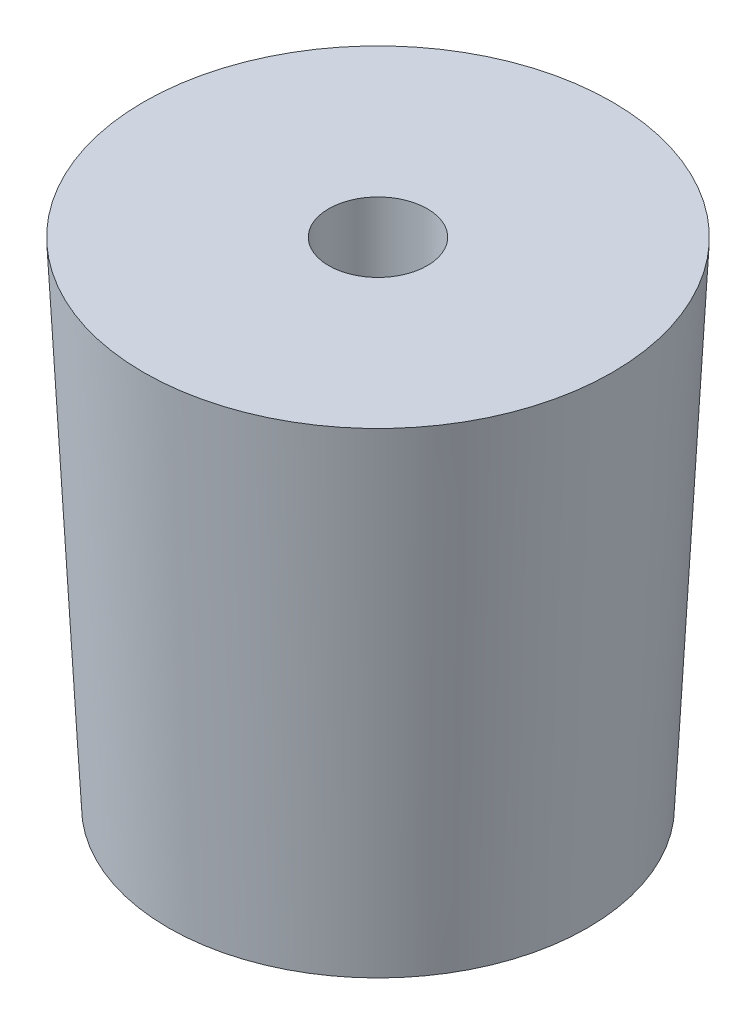
ISO-10303-21;
HEADER;
FILE_DESCRIPTION(('STEP AP214'),'2;1');
FILE_NAME('part.step','',(''),(''),'','','');
FILE_SCHEMA(('AUTOMOTIVE_DESIGN { 1 0 10303 214 1 1 1 1 }'));
ENDSEC;
DATA;
#1=APPLICATION_CONTEXT('core data for automotive mechanical design processes');
#2=APPLICATION_PROTOCOL_DEFINITION('international standard','automotive_design',2000,#1);
#3=PRODUCT_CONTEXT('',#1,'mechanical');
#4=PRODUCT('Part','Part','',(#3));
#5=PRODUCT_RELATED_PRODUCT_CATEGORY('part','',(#4));
#6=PRODUCT_DEFINITION_FORMATION('','',#4);
#7=PRODUCT_DEFINITION_CONTEXT('part definition',#1,'design');
#8=PRODUCT_DEFINITION('design','',#6,#7);
#9=PRODUCT_DEFINITION_SHAPE('','',#8);
#10=(LENGTH_UNIT() NAMED_UNIT(*) SI_UNIT(.MILLI.,.METRE.));
#11=(NAMED_UNIT(*) PLANE_ANGLE_UNIT() SI_UNIT($,.RADIAN.));
#12=(NAMED_UNIT(*) SI_UNIT($,.STERADIAN.) SOLID_ANGLE_UNIT());
#13=UNCERTAINTY_MEASURE_WITH_UNIT(LENGTH_MEASURE(1.E-05),#10,'distance_accuracy_value','');
#14=(GEOMETRIC_REPRESENTATION_CONTEXT(3) GLOBAL_UNCERTAINTY_ASSIGNED_CONTEXT((#13)) GLOBAL_UNIT_ASSIGNED_CONTEXT((#10,
#11,#12)) REPRESENTATION_CONTEXT('',''));
#15=CARTESIAN_POINT('',(0.,0.,0.));
#16=DIRECTION('',(0.,0.,1.));
#17=DIRECTION('',(1.,0.,0.));
#18=AXIS2_PLACEMENT_3D('',#15,#16,#17);
#19=CARTESIAN_POINT('',(0.,20.,0.));
#20=DIRECTION('',(0.,-1.,0.));
#21=DIRECTION('',(0.,0.,-1.));
#22=AXIS2_PLACEMENT_3D('',#19,#20,#21);
#23=CYLINDRICAL_SURFACE('',#22,2.);
#24=CARTESIAN_POINT('',(0.,20.,0.));
#25=DIRECTION('',(0.,1.,0.));
#26=DIRECTION('',(0.,0.,1.));
#27=AXIS2_PLACEMENT_3D('',#24,#25,#26);
#28=CIRCLE('',#27,2.);
#29=CARTESIAN_POINT('',(0.,20.,2.));
#30=VERTEX_POINT('',#29);
#31=EDGE_CURVE('E10',#30,#30,#28,.T.);
#32=ORIENTED_EDGE('',*,*,#31,.T.);
#33=EDGE_LOOP('',(#32));
#34=FACE_BOUND('',#33,.T.);
#35=CARTESIAN_POINT('',(0.,10.,0.));
#36=DIRECTION('',(0.,-1.,0.));
#37=DIRECTION('',(0.,0.,-1.));
#38=AXIS2_PLACEMENT_3D('',#35,#36,#37);
#39=CIRCLE('',#38,2.);
#40=CARTESIAN_POINT('',(0.,10.,-2.));
#41=VERTEX_POINT('',#40);
#42=EDGE_CURVE('E34',#41,#41,#39,.T.);
#43=ORIENTED_EDGE('',*,*,#42,.T.);
#44=EDGE_LOOP('',(#43));
#45=FACE_BOUND('',#44,.T.);
#46=ADVANCED_FACE('F30',(#34,#45),#23,.F.);
#47=CARTESIAN_POINT('',(0.,0.,0.));
#48=DIRECTION('',(0.,1.,0.));
#49=DIRECTION('',(0.,0.,1.));
#50=AXIS2_PLACEMENT_3D('',#47,#48,#49);
#51=PLANE('',#50);
#52=CARTESIAN_POINT('',(0.,0.,0.));
#53=DIRECTION('',(0.,-1.,0.));
#54=DIRECTION('',(0.,0.,-1.));
#55=AXIS2_PLACEMENT_3D('',#52,#53,#54);
#56=CIRCLE('',#55,5.);
#57=CARTESIAN_POINT('',(0.,0.,-5.));
#58=VERTEX_POINT('',#57);
#59=EDGE_CURVE('E47',#58,#58,#56,.T.);
#60=ORIENTED_EDGE('',*,*,#59,.F.);
#61=EDGE_LOOP('',(#60));
#62=FACE_BOUND('',#61,.T.);
#63=CARTESIAN_POINT('',(0.,0.,0.));
#64=DIRECTION('',(0.,1.,0.));
#65=DIRECTION('',(0.,0.,1.));
#66=AXIS2_PLACEMENT_3D('',#63,#64,#65);
#67=CIRCLE('',#66,8.5);
#68=CARTESIAN_POINT('',(0.,0.,8.5));
#69=VERTEX_POINT('',#68);
#70=EDGE_CURVE('E38',#69,#69,#67,.T.);
#71=ORIENTED_EDGE('',*,*,#70,.F.);
#72=EDGE_LOOP('',(#71));
#73=FACE_BOUND('',#72,.T.);
#74=ADVANCED_FACE('F32',(#62,#73),#51,.F.);
#75=CARTESIAN_POINT('',(0.,20.,0.));
#76=DIRECTION('',(0.,1.,0.));
#77=DIRECTION('',(0.,0.,1.));
#78=AXIS2_PLACEMENT_3D('',#75,#76,#77);
#79=PLANE('',#78);
#80=CARTESIAN_POINT('',(0.,20.,0.));
#81=DIRECTION('',(0.,1.,0.));
#82=DIRECTION('',(0.,0.,1.));
#83=AXIS2_PLACEMENT_3D('',#80,#81,#82);
#84=CIRCLE('',#83,9.5);
#85=CARTESIAN_POINT('',(0.,20.,9.5));
#86=VERTEX_POINT('',#85);
#87=EDGE_CURVE('E42',#86,#86,#84,.T.);
#88=ORIENTED_EDGE('',*,*,#87,.T.);
#89=EDGE_LOOP('',(#88));
#90=FACE_BOUND('',#89,.T.);
#91=ORIENTED_EDGE('',*,*,#31,.F.);
#92=EDGE_LOOP('',(#91));
#93=FACE_BOUND('',#92,.T.);
#94=ADVANCED_FACE('F73',(#90,#93),#79,.T.);
#95=CARTESIAN_POINT('',(0.,0.,0.));
#96=DIRECTION('',(0.,1.,0.));
#97=DIRECTION('',(0.,0.,1.));
#98=AXIS2_PLACEMENT_3D('',#95,#96,#97);
#99=CONICAL_SURFACE('',#98,8.5,0.0499583957219427);
#100=ORIENTED_EDGE('',*,*,#87,.F.);
#101=EDGE_LOOP('',(#100));
#102=FACE_BOUND('',#101,.T.);
#103=ORIENTED_EDGE('',*,*,#70,.T.);
#104=EDGE_LOOP('',(#103));
#105=FACE_BOUND('',#104,.T.);
#106=ADVANCED_FACE('F65',(#102,#105),#99,.T.);
#107=CARTESIAN_POINT('',(0.,10.,0.));
#108=DIRECTION('',(0.,-1.,0.));
#109=DIRECTION('',(0.,0.,-1.));
#110=AXIS2_PLACEMENT_3D('',#107,#108,#109);
#111=CYLINDRICAL_SURFACE('',#110,5.);
#112=CARTESIAN_POINT('',(0.,10.,0.));
#113=DIRECTION('',(0.,-1.,0.));
#114=DIRECTION('',(0.,0.,-1.));
#115=AXIS2_PLACEMENT_3D('',#112,#113,#114);
#116=CIRCLE('',#115,5.);
#117=CARTESIAN_POINT('',(0.,10.,-5.));
#118=VERTEX_POINT('',#117);
#119=EDGE_CURVE('E50',#118,#118,#116,.T.);
#120=ORIENTED_EDGE('',*,*,#119,.F.);
#121=EDGE_LOOP('',(#120));
#122=FACE_BOUND('',#121,.T.);
#123=ORIENTED_EDGE('',*,*,#59,.T.);
#124=EDGE_LOOP('',(#123));
#125=FACE_BOUND('',#124,.T.);
#126=ADVANCED_FACE('F60',(#122,#125),#111,.F.);
#127=CARTESIAN_POINT('',(0.,10.,0.));
#128=DIRECTION('',(0.,-1.,0.));
#129=DIRECTION('',(0.,0.,-1.));
#130=AXIS2_PLACEMENT_3D('',#127,#128,#129);
#131=PLANE('',#130);
#132=ORIENTED_EDGE('',*,*,#42,.F.);
#133=EDGE_LOOP('',(#132));
#134=FACE_BOUND('',#133,.T.);
#135=ORIENTED_EDGE('',*,*,#119,.T.);
#136=EDGE_LOOP('',(#135));
#137=FACE_BOUND('',#136,.T.);
#138=ADVANCED_FACE('F58',(#134,#137),#131,.T.);
#139=CLOSED_SHELL('',(#46,#74,#94,#106,#126,#138));
#140=MANIFOLD_SOLID_BREP('B2',#139);
#141=ADVANCED_BREP_SHAPE_REPRESENTATION('',(#18,#140),#14);
#142=SHAPE_DEFINITION_REPRESENTATION(#9,#141);
ENDSEC;
END-ISO-10303-21;
